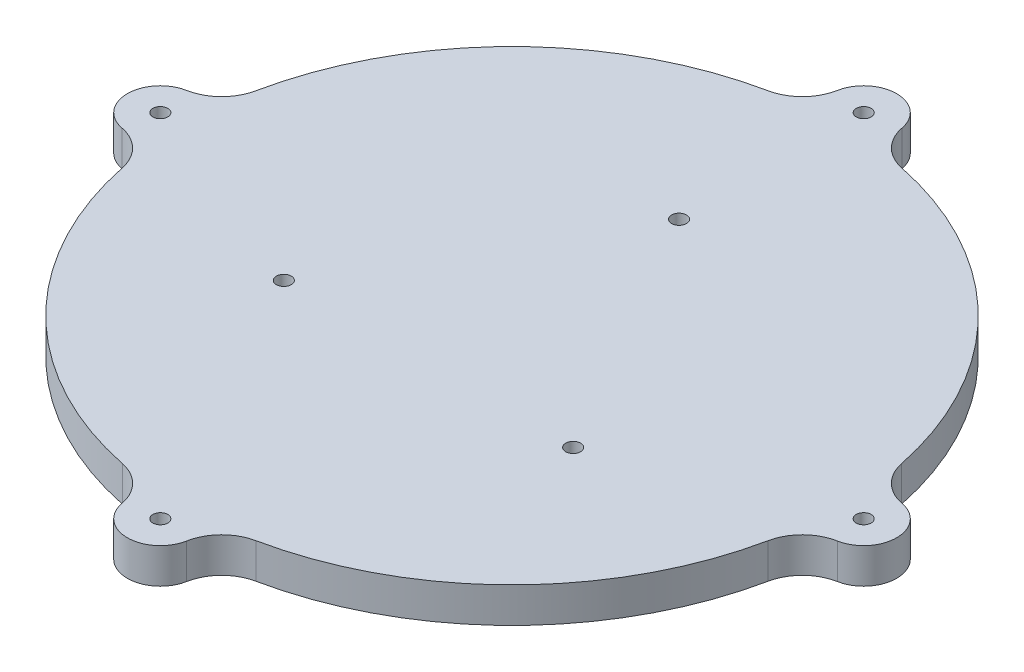
ISO-10303-21;
HEADER;
FILE_DESCRIPTION(('STEP AP214'),'2;1');
FILE_NAME('part.step','',(''),(''),'','','');
FILE_SCHEMA(('AUTOMOTIVE_DESIGN { 1 0 10303 214 1 1 1 1 }'));
ENDSEC;
DATA;
#1=APPLICATION_CONTEXT('core data for automotive mechanical design processes');
#2=APPLICATION_PROTOCOL_DEFINITION('international standard','automotive_design',2000,#1);
#3=PRODUCT_CONTEXT('',#1,'mechanical');
#4=PRODUCT('Part','Part','',(#3));
#5=PRODUCT_RELATED_PRODUCT_CATEGORY('part','',(#4));
#6=PRODUCT_DEFINITION_FORMATION('','',#4);
#7=PRODUCT_DEFINITION_CONTEXT('part definition',#1,'design');
#8=PRODUCT_DEFINITION('design','',#6,#7);
#9=PRODUCT_DEFINITION_SHAPE('','',#8);
#10=(LENGTH_UNIT() NAMED_UNIT(*) SI_UNIT(.MILLI.,.METRE.));
#11=(NAMED_UNIT(*) PLANE_ANGLE_UNIT() SI_UNIT($,.RADIAN.));
#12=(NAMED_UNIT(*) SI_UNIT($,.STERADIAN.) SOLID_ANGLE_UNIT());
#13=UNCERTAINTY_MEASURE_WITH_UNIT(LENGTH_MEASURE(1.E-05),#10,'distance_accuracy_value','');
#14=(GEOMETRIC_REPRESENTATION_CONTEXT(3) GLOBAL_UNCERTAINTY_ASSIGNED_CONTEXT((#13)) GLOBAL_UNIT_ASSIGNED_CONTEXT((#10,
#11,#12)) REPRESENTATION_CONTEXT('',''));
#15=CARTESIAN_POINT('',(0.,0.,0.));
#16=DIRECTION('',(0.,0.,1.));
#17=DIRECTION('',(1.,0.,0.));
#18=AXIS2_PLACEMENT_3D('',#15,#16,#17);
#19=CARTESIAN_POINT('',(0.,8.,0.));
#20=DIRECTION('',(0.,-1.,0.));
#21=DIRECTION('',(0.,0.,-1.));
#22=AXIS2_PLACEMENT_3D('',#19,#20,#21);
#23=CYLINDRICAL_SURFACE('',#22,75.);
#24=CARTESIAN_POINT('',(0.,8.,0.));
#25=DIRECTION('',(0.,1.,0.));
#26=DIRECTION('',(0.,0.,1.));
#27=AXIS2_PLACEMENT_3D('',#24,#25,#26);
#28=CIRCLE('',#27,75.);
#29=CARTESIAN_POINT('',(73.4489889705883,8.,-15.1738597330541));
#30=VERTEX_POINT('',#29);
#31=CARTESIAN_POINT('',(15.1738597330543,8.,-73.4489889705883));
#32=VERTEX_POINT('',#31);
#33=EDGE_CURVE('E247',#30,#32,#28,.T.);
#34=ORIENTED_EDGE('',*,*,#33,.F.);
#35=DIRECTION('',(0.,-1.,0.));
#36=VECTOR('',#35,1.);
#37=CARTESIAN_POINT('',(73.4489889705883,8.,-15.1738597330541));
#38=LINE('',#37,#36);
#39=CARTESIAN_POINT('',(73.4489889705883,0.,-15.1738597330541));
#40=VERTEX_POINT('',#39);
#41=EDGE_CURVE('E266',#30,#40,#38,.T.);
#42=ORIENTED_EDGE('',*,*,#41,.T.);
#43=CARTESIAN_POINT('',(0.,0.,0.));
#44=DIRECTION('',(0.,1.,0.));
#45=DIRECTION('',(0.,0.,1.));
#46=AXIS2_PLACEMENT_3D('',#43,#44,#45);
#47=CIRCLE('',#46,75.);
#48=CARTESIAN_POINT('',(15.1738597330543,0.,-73.4489889705883));
#49=VERTEX_POINT('',#48);
#50=EDGE_CURVE('E195',#40,#49,#47,.T.);
#51=ORIENTED_EDGE('',*,*,#50,.T.);
#52=DIRECTION('',(0.,-1.,0.));
#53=VECTOR('',#52,1.);
#54=CARTESIAN_POINT('',(15.1738597330543,8.,-73.4489889705883));
#55=LINE('',#54,#53);
#56=EDGE_CURVE('E263',#49,#32,#55,.F.);
#57=ORIENTED_EDGE('',*,*,#56,.T.);
#58=EDGE_LOOP('',(#34,#42,#51,#57));
#59=FACE_BOUND('',#58,.T.);
#60=ADVANCED_FACE('F44',(#59),#23,.T.);
#61=CARTESIAN_POINT('',(0.,8.,-80.));
#62=DIRECTION('',(0.,-1.,0.));
#63=DIRECTION('',(0.,0.,-1.));
#64=AXIS2_PLACEMENT_3D('',#61,#62,#63);
#65=CYLINDRICAL_SURFACE('',#64,7.5);
#66=CARTESIAN_POINT('',(0.,8.,-80.));
#67=DIRECTION('',(0.,1.,0.));
#68=DIRECTION('',(0.,0.,1.));
#69=AXIS2_PLACEMENT_3D('',#66,#67,#68);
#70=CIRCLE('',#69,7.5);
#71=CARTESIAN_POINT('',(7.37016044176925,8.,-81.3895089285714));
#72=VERTEX_POINT('',#71);
#73=CARTESIAN_POINT('',(-7.37016044176925,8.,-81.3895089285714));
#74=VERTEX_POINT('',#73);
#75=EDGE_CURVE('E499',#72,#74,#70,.T.);
#76=ORIENTED_EDGE('',*,*,#75,.F.);
#77=DIRECTION('',(0.,-1.,0.));
#78=VECTOR('',#77,1.);
#79=CARTESIAN_POINT('',(7.37016044176925,8.,-81.3895089285714));
#80=LINE('',#79,#78);
#81=CARTESIAN_POINT('',(7.37016044176925,0.,-81.3895089285714));
#82=VERTEX_POINT('',#81);
#83=EDGE_CURVE('E272',#72,#82,#80,.T.);
#84=ORIENTED_EDGE('',*,*,#83,.T.);
#85=CARTESIAN_POINT('',(0.,0.,-80.));
#86=DIRECTION('',(0.,1.,0.));
#87=DIRECTION('',(0.,0.,1.));
#88=AXIS2_PLACEMENT_3D('',#85,#86,#87);
#89=CIRCLE('',#88,7.5);
#90=CARTESIAN_POINT('',(-7.37016044176925,0.,-81.3895089285714));
#91=VERTEX_POINT('',#90);
#92=EDGE_CURVE('E209',#82,#91,#89,.T.);
#93=ORIENTED_EDGE('',*,*,#92,.T.);
#94=DIRECTION('',(0.,-1.,0.));
#95=VECTOR('',#94,1.);
#96=CARTESIAN_POINT('',(-7.37016044176925,8.,-81.3895089285714));
#97=LINE('',#96,#95);
#98=EDGE_CURVE('E269',#91,#74,#97,.F.);
#99=ORIENTED_EDGE('',*,*,#98,.T.);
#100=EDGE_LOOP('',(#76,#84,#93,#99));
#101=FACE_BOUND('',#100,.T.);
#102=ADVANCED_FACE('F359',(#101),#65,.T.);
#103=CARTESIAN_POINT('',(-15.1738597330543,8.,-73.4489889705883));
#104=VERTEX_POINT('',#103);
#105=CARTESIAN_POINT('',(-73.4489889705881,8.,-15.1738597330551));
#106=VERTEX_POINT('',#105);
#107=EDGE_CURVE('E409',#104,#106,#28,.T.);
#108=ORIENTED_EDGE('',*,*,#107,.F.);
#109=DIRECTION('',(0.,-1.,0.));
#110=VECTOR('',#109,1.);
#111=CARTESIAN_POINT('',(-15.1738597330543,8.,-73.4489889705883));
#112=LINE('',#111,#110);
#113=CARTESIAN_POINT('',(-15.1738597330543,0.,-73.4489889705883));
#114=VERTEX_POINT('',#113);
#115=EDGE_CURVE('E279',#104,#114,#112,.T.);
#116=ORIENTED_EDGE('',*,*,#115,.T.);
#117=CARTESIAN_POINT('',(-73.4489889705881,0.,-15.1738597330551));
#118=VERTEX_POINT('',#117);
#119=EDGE_CURVE('E206',#114,#118,#47,.T.);
#120=ORIENTED_EDGE('',*,*,#119,.T.);
#121=DIRECTION('',(0.,-1.,0.));
#122=VECTOR('',#121,1.);
#123=CARTESIAN_POINT('',(-73.4489889705881,8.,-15.1738597330551));
#124=LINE('',#123,#122);
#125=EDGE_CURVE('E276',#118,#106,#124,.F.);
#126=ORIENTED_EDGE('',*,*,#125,.T.);
#127=EDGE_LOOP('',(#108,#116,#120,#126));
#128=FACE_BOUND('',#127,.T.);
#129=ADVANCED_FACE('F361',(#128),#23,.T.);
#130=CARTESIAN_POINT('',(-80.,8.,-8.37955521322352E-13));
#131=DIRECTION('',(0.,-1.,0.));
#132=DIRECTION('',(0.,0.,-1.));
#133=AXIS2_PLACEMENT_3D('',#130,#131,#132);
#134=CYLINDRICAL_SURFACE('',#133,7.5);
#135=CARTESIAN_POINT('',(-80.,8.,-8.37955521322352E-13));
#136=DIRECTION('',(0.,1.,0.));
#137=DIRECTION('',(0.,0.,1.));
#138=AXIS2_PLACEMENT_3D('',#135,#136,#137);
#139=CIRCLE('',#138,7.5);
#140=CARTESIAN_POINT('',(-81.3895089285713,8.,-7.3701604417701));
#141=VERTEX_POINT('',#140);
#142=CARTESIAN_POINT('',(-81.3895089285715,8.,7.3701604417684));
#143=VERTEX_POINT('',#142);
#144=EDGE_CURVE('E408',#141,#143,#139,.T.);
#145=ORIENTED_EDGE('',*,*,#144,.F.);
#146=DIRECTION('',(0.,-1.,0.));
#147=VECTOR('',#146,1.);
#148=CARTESIAN_POINT('',(-81.3895089285713,8.,-7.3701604417701));
#149=LINE('',#148,#147);
#150=CARTESIAN_POINT('',(-81.3895089285713,0.,-7.3701604417701));
#151=VERTEX_POINT('',#150);
#152=EDGE_CURVE('E285',#141,#151,#149,.T.);
#153=ORIENTED_EDGE('',*,*,#152,.T.);
#154=CARTESIAN_POINT('',(-80.,0.,-8.37955521322352E-13));
#155=DIRECTION('',(0.,1.,0.));
#156=DIRECTION('',(0.,0.,1.));
#157=AXIS2_PLACEMENT_3D('',#154,#155,#156);
#158=CIRCLE('',#157,7.5);
#159=CARTESIAN_POINT('',(-81.3895089285715,0.,7.3701604417684));
#160=VERTEX_POINT('',#159);
#161=EDGE_CURVE('E205',#151,#160,#158,.T.);
#162=ORIENTED_EDGE('',*,*,#161,.T.);
#163=DIRECTION('',(0.,-1.,0.));
#164=VECTOR('',#163,1.);
#165=CARTESIAN_POINT('',(-81.3895089285715,8.,7.3701604417684));
#166=LINE('',#165,#164);
#167=EDGE_CURVE('E282',#160,#143,#166,.F.);
#168=ORIENTED_EDGE('',*,*,#167,.T.);
#169=EDGE_LOOP('',(#145,#153,#162,#168));
#170=FACE_BOUND('',#169,.T.);
#171=ADVANCED_FACE('F371',(#170),#134,.T.);
#172=CARTESIAN_POINT('',(-73.4489889705884,0.,15.1738597330536));
#173=VERTEX_POINT('',#172);
#174=CARTESIAN_POINT('',(-15.1738597330548,0.,73.4489889705881));
#175=VERTEX_POINT('',#174);
#176=EDGE_CURVE('E194',#173,#175,#47,.T.);
#177=ORIENTED_EDGE('',*,*,#176,.T.);
#178=DIRECTION('',(0.,-1.,0.));
#179=VECTOR('',#178,1.);
#180=CARTESIAN_POINT('',(-15.1738597330548,8.,73.4489889705881));
#181=LINE('',#180,#179);
#182=CARTESIAN_POINT('',(-15.1738597330548,8.,73.4489889705881));
#183=VERTEX_POINT('',#182);
#184=EDGE_CURVE('E62',#175,#183,#181,.F.);
#185=ORIENTED_EDGE('',*,*,#184,.T.);
#186=CARTESIAN_POINT('',(-73.4489889705884,8.,15.1738597330536));
#187=VERTEX_POINT('',#186);
#188=EDGE_CURVE('E401',#187,#183,#28,.T.);
#189=ORIENTED_EDGE('',*,*,#188,.F.);
#190=DIRECTION('',(0.,-1.,0.));
#191=VECTOR('',#190,1.);
#192=CARTESIAN_POINT('',(-73.4489889705884,8.,15.1738597330536));
#193=LINE('',#192,#191);
#194=EDGE_CURVE('E288',#187,#173,#193,.T.);
#195=ORIENTED_EDGE('',*,*,#194,.T.);
#196=EDGE_LOOP('',(#177,#185,#189,#195));
#197=FACE_BOUND('',#196,.T.);
#198=ADVANCED_FACE('F372',(#197),#23,.T.);
#199=CARTESIAN_POINT('',(-5.58637014214901E-13,8.,80.));
#200=DIRECTION('',(0.,-1.,0.));
#201=DIRECTION('',(0.,0.,-1.));
#202=AXIS2_PLACEMENT_3D('',#199,#200,#201);
#203=CYLINDRICAL_SURFACE('',#202,7.5);
#204=CARTESIAN_POINT('',(-5.58637014214901E-13,0.,80.));
#205=DIRECTION('',(0.,1.,0.));
#206=DIRECTION('',(0.,0.,1.));
#207=AXIS2_PLACEMENT_3D('',#204,#205,#206);
#208=CIRCLE('',#207,7.5);
#209=CARTESIAN_POINT('',(-7.37016044176982,0.,81.3895089285714));
#210=VERTEX_POINT('',#209);
#211=CARTESIAN_POINT('',(7.37016044176868,0.,81.3895089285715));
#212=VERTEX_POINT('',#211);
#213=EDGE_CURVE('E192',#210,#212,#208,.T.);
#214=ORIENTED_EDGE('',*,*,#213,.T.);
#215=DIRECTION('',(0.,-1.,0.));
#216=VECTOR('',#215,1.);
#217=CARTESIAN_POINT('',(7.37016044176868,8.,81.3895089285715));
#218=LINE('',#217,#216);
#219=CARTESIAN_POINT('',(7.37016044176868,8.,81.3895089285715));
#220=VERTEX_POINT('',#219);
#221=EDGE_CURVE('E165',#212,#220,#218,.F.);
#222=ORIENTED_EDGE('',*,*,#221,.T.);
#223=CARTESIAN_POINT('',(-5.58637014214901E-13,8.,80.));
#224=DIRECTION('',(0.,1.,0.));
#225=DIRECTION('',(0.,0.,1.));
#226=AXIS2_PLACEMENT_3D('',#223,#224,#225);
#227=CIRCLE('',#226,7.5);
#228=CARTESIAN_POINT('',(-7.37016044176982,8.,81.3895089285714));
#229=VERTEX_POINT('',#228);
#230=EDGE_CURVE('E400',#229,#220,#227,.T.);
#231=ORIENTED_EDGE('',*,*,#230,.F.);
#232=DIRECTION('',(0.,-1.,0.));
#233=VECTOR('',#232,1.);
#234=CARTESIAN_POINT('',(-7.37016044176982,8.,81.3895089285714));
#235=LINE('',#234,#233);
#236=EDGE_CURVE('E182',#229,#210,#235,.T.);
#237=ORIENTED_EDGE('',*,*,#236,.T.);
#238=EDGE_LOOP('',(#214,#222,#231,#237));
#239=FACE_BOUND('',#238,.T.);
#240=ADVANCED_FACE('F375',(#239),#203,.T.);
#241=CARTESIAN_POINT('',(15.1738597330538,8.,73.4489889705883));
#242=VERTEX_POINT('',#241);
#243=CARTESIAN_POINT('',(73.4489889705882,8.,15.1738597330546));
#244=VERTEX_POINT('',#243);
#245=EDGE_CURVE('E180',#242,#244,#28,.T.);
#246=ORIENTED_EDGE('',*,*,#245,.F.);
#247=DIRECTION('',(0.,-1.,0.));
#248=VECTOR('',#247,1.);
#249=CARTESIAN_POINT('',(15.1738597330538,8.,73.4489889705883));
#250=LINE('',#249,#248);
#251=CARTESIAN_POINT('',(15.1738597330538,0.,73.4489889705883));
#252=VERTEX_POINT('',#251);
#253=EDGE_CURVE('E164',#242,#252,#250,.T.);
#254=ORIENTED_EDGE('',*,*,#253,.T.);
#255=CARTESIAN_POINT('',(73.4489889705882,0.,15.1738597330546));
#256=VERTEX_POINT('',#255);
#257=EDGE_CURVE('E177',#252,#256,#47,.T.);
#258=ORIENTED_EDGE('',*,*,#257,.T.);
#259=DIRECTION('',(0.,-1.,0.));
#260=VECTOR('',#259,1.);
#261=CARTESIAN_POINT('',(73.4489889705882,8.,15.1738597330546));
#262=LINE('',#261,#260);
#263=EDGE_CURVE('E183',#256,#244,#262,.F.);
#264=ORIENTED_EDGE('',*,*,#263,.T.);
#265=EDGE_LOOP('',(#246,#254,#258,#264));
#266=FACE_BOUND('',#265,.T.);
#267=ADVANCED_FACE('F176',(#266),#23,.T.);
#268=CARTESIAN_POINT('',(-5.58637014214901E-13,8.,80.));
#269=DIRECTION('',(0.,-1.,0.));
#270=DIRECTION('',(0.,0.,-1.));
#271=AXIS2_PLACEMENT_3D('',#268,#269,#270);
#272=CYLINDRICAL_SURFACE('',#271,1.7);
#273=CARTESIAN_POINT('',(-5.58637014214901E-13,8.,80.));
#274=DIRECTION('',(0.,1.,0.));
#275=DIRECTION('',(0.,0.,1.));
#276=AXIS2_PLACEMENT_3D('',#273,#274,#275);
#277=CIRCLE('',#276,1.7);
#278=CARTESIAN_POINT('',(-5.58637014214901E-13,8.,81.7));
#279=VERTEX_POINT('',#278);
#280=EDGE_CURVE('E423',#279,#279,#277,.T.);
#281=ORIENTED_EDGE('',*,*,#280,.T.);
#282=EDGE_LOOP('',(#281));
#283=FACE_BOUND('',#282,.T.);
#284=CARTESIAN_POINT('',(-5.58637014214901E-13,0.,80.));
#285=DIRECTION('',(0.,1.,0.));
#286=DIRECTION('',(0.,0.,1.));
#287=AXIS2_PLACEMENT_3D('',#284,#285,#286);
#288=CIRCLE('',#287,1.7);
#289=CARTESIAN_POINT('',(-5.58637014214901E-13,0.,81.7));
#290=VERTEX_POINT('',#289);
#291=EDGE_CURVE('E239',#290,#290,#288,.T.);
#292=ORIENTED_EDGE('',*,*,#291,.F.);
#293=EDGE_LOOP('',(#292));
#294=FACE_BOUND('',#293,.T.);
#295=ADVANCED_FACE('F374',(#283,#294),#272,.F.);
#296=CARTESIAN_POINT('',(80.,8.,2.79318507107451E-13));
#297=DIRECTION('',(0.,-1.,0.));
#298=DIRECTION('',(0.,0.,-1.));
#299=AXIS2_PLACEMENT_3D('',#296,#297,#298);
#300=CYLINDRICAL_SURFACE('',#299,1.7);
#301=CARTESIAN_POINT('',(80.,8.,2.79318507107451E-13));
#302=DIRECTION('',(0.,1.,0.));
#303=DIRECTION('',(0.,0.,1.));
#304=AXIS2_PLACEMENT_3D('',#301,#302,#303);
#305=CIRCLE('',#304,1.7);
#306=CARTESIAN_POINT('',(80.,8.,1.70000000000028));
#307=VERTEX_POINT('',#306);
#308=EDGE_CURVE('E419',#307,#307,#305,.T.);
#309=ORIENTED_EDGE('',*,*,#308,.T.);
#310=EDGE_LOOP('',(#309));
#311=FACE_BOUND('',#310,.T.);
#312=CARTESIAN_POINT('',(80.,0.,2.79318507107451E-13));
#313=DIRECTION('',(0.,1.,0.));
#314=DIRECTION('',(0.,0.,1.));
#315=AXIS2_PLACEMENT_3D('',#312,#313,#314);
#316=CIRCLE('',#315,1.7);
#317=CARTESIAN_POINT('',(80.,0.,1.70000000000028));
#318=VERTEX_POINT('',#317);
#319=EDGE_CURVE('E235',#318,#318,#316,.T.);
#320=ORIENTED_EDGE('',*,*,#319,.F.);
#321=EDGE_LOOP('',(#320));
#322=FACE_BOUND('',#321,.T.);
#323=ADVANCED_FACE('F380',(#311,#322),#300,.F.);
#324=CARTESIAN_POINT('',(0.,8.,-80.));
#325=DIRECTION('',(0.,-1.,0.));
#326=DIRECTION('',(0.,0.,-1.));
#327=AXIS2_PLACEMENT_3D('',#324,#325,#326);
#328=CYLINDRICAL_SURFACE('',#327,1.7);
#329=CARTESIAN_POINT('',(0.,8.,-80.));
#330=DIRECTION('',(0.,1.,0.));
#331=DIRECTION('',(0.,0.,1.));
#332=AXIS2_PLACEMENT_3D('',#329,#330,#331);
#333=CIRCLE('',#332,1.7);
#334=CARTESIAN_POINT('',(0.,8.,-78.3));
#335=VERTEX_POINT('',#334);
#336=EDGE_CURVE('E415',#335,#335,#333,.T.);
#337=ORIENTED_EDGE('',*,*,#336,.T.);
#338=EDGE_LOOP('',(#337));
#339=FACE_BOUND('',#338,.T.);
#340=CARTESIAN_POINT('',(0.,0.,-80.));
#341=DIRECTION('',(0.,1.,0.));
#342=DIRECTION('',(0.,0.,1.));
#343=AXIS2_PLACEMENT_3D('',#340,#341,#342);
#344=CIRCLE('',#343,1.7);
#345=CARTESIAN_POINT('',(0.,0.,-78.3));
#346=VERTEX_POINT('',#345);
#347=EDGE_CURVE('E199',#346,#346,#344,.T.);
#348=ORIENTED_EDGE('',*,*,#347,.F.);
#349=EDGE_LOOP('',(#348));
#350=FACE_BOUND('',#349,.T.);
#351=ADVANCED_FACE('F449',(#339,#350),#328,.F.);
#352=CARTESIAN_POINT('',(80.,8.,2.79318507107451E-13));
#353=DIRECTION('',(0.,-1.,0.));
#354=DIRECTION('',(0.,0.,-1.));
#355=AXIS2_PLACEMENT_3D('',#352,#353,#354);
#356=CYLINDRICAL_SURFACE('',#355,7.5);
#357=CARTESIAN_POINT('',(80.,8.,2.79318507107451E-13));
#358=DIRECTION('',(0.,1.,0.));
#359=DIRECTION('',(0.,0.,1.));
#360=AXIS2_PLACEMENT_3D('',#357,#358,#359);
#361=CIRCLE('',#360,7.5);
#362=CARTESIAN_POINT('',(81.3895089285714,8.,7.37016044176953));
#363=VERTEX_POINT('',#362);
#364=CARTESIAN_POINT('',(81.3895089285715,8.,-7.37016044176897));
#365=VERTEX_POINT('',#364);
#366=EDGE_CURVE('E406',#363,#365,#361,.T.);
#367=ORIENTED_EDGE('',*,*,#366,.F.);
#368=DIRECTION('',(0.,-1.,0.));
#369=VECTOR('',#368,1.);
#370=CARTESIAN_POINT('',(81.3895089285714,8.,7.37016044176953));
#371=LINE('',#370,#369);
#372=CARTESIAN_POINT('',(81.3895089285714,0.,7.37016044176953));
#373=VERTEX_POINT('',#372);
#374=EDGE_CURVE('E259',#363,#373,#371,.T.);
#375=ORIENTED_EDGE('',*,*,#374,.T.);
#376=CARTESIAN_POINT('',(80.,0.,2.79318507107451E-13));
#377=DIRECTION('',(0.,1.,0.));
#378=DIRECTION('',(0.,0.,1.));
#379=AXIS2_PLACEMENT_3D('',#376,#377,#378);
#380=CIRCLE('',#379,7.5);
#381=CARTESIAN_POINT('',(81.3895089285715,0.,-7.37016044176897));
#382=VERTEX_POINT('',#381);
#383=EDGE_CURVE('E191',#373,#382,#380,.T.);
#384=ORIENTED_EDGE('',*,*,#383,.T.);
#385=DIRECTION('',(0.,-1.,0.));
#386=VECTOR('',#385,1.);
#387=CARTESIAN_POINT('',(81.3895089285715,8.,-7.37016044176897));
#388=LINE('',#387,#386);
#389=EDGE_CURVE('E256',#382,#365,#388,.F.);
#390=ORIENTED_EDGE('',*,*,#389,.T.);
#391=EDGE_LOOP('',(#367,#375,#384,#390));
#392=FACE_BOUND('',#391,.T.);
#393=ADVANCED_FACE('F442',(#392),#356,.T.);
#394=CARTESIAN_POINT('',(-80.,8.,-8.37955521322352E-13));
#395=DIRECTION('',(0.,-1.,0.));
#396=DIRECTION('',(0.,0.,-1.));
#397=AXIS2_PLACEMENT_3D('',#394,#395,#396);
#398=CYLINDRICAL_SURFACE('',#397,1.7);
#399=CARTESIAN_POINT('',(-80.,8.,-8.37955521322352E-13));
#400=DIRECTION('',(0.,1.,0.));
#401=DIRECTION('',(0.,0.,1.));
#402=AXIS2_PLACEMENT_3D('',#399,#400,#401);
#403=CIRCLE('',#402,1.7);
#404=CARTESIAN_POINT('',(-80.,8.,1.69999999999917));
#405=VERTEX_POINT('',#404);
#406=EDGE_CURVE('E249',#405,#405,#403,.T.);
#407=ORIENTED_EDGE('',*,*,#406,.T.);
#408=EDGE_LOOP('',(#407));
#409=FACE_BOUND('',#408,.T.);
#410=CARTESIAN_POINT('',(-80.,0.,-8.37955521322352E-13));
#411=DIRECTION('',(0.,1.,0.));
#412=DIRECTION('',(0.,0.,1.));
#413=AXIS2_PLACEMENT_3D('',#410,#411,#412);
#414=CIRCLE('',#413,1.7);
#415=CARTESIAN_POINT('',(-80.,0.,1.69999999999917));
#416=VERTEX_POINT('',#415);
#417=EDGE_CURVE('E243',#416,#416,#414,.T.);
#418=ORIENTED_EDGE('',*,*,#417,.F.);
#419=EDGE_LOOP('',(#418));
#420=FACE_BOUND('',#419,.T.);
#421=ADVANCED_FACE('F430',(#409,#420),#398,.F.);
#422=CARTESIAN_POINT('',(0.,8.,0.));
#423=DIRECTION('',(0.,1.,0.));
#424=DIRECTION('',(0.,0.,1.));
#425=AXIS2_PLACEMENT_3D('',#422,#423,#424);
#426=PLANE('',#425);
#427=CARTESIAN_POINT('',(0.,8.,-38.));
#428=DIRECTION('',(0.,1.,0.));
#429=DIRECTION('',(0.,0.,1.));
#430=AXIS2_PLACEMENT_3D('',#427,#428,#429);
#431=CIRCLE('',#430,1.7);
#432=CARTESIAN_POINT('',(0.,8.,-36.3));
#433=VERTEX_POINT('',#432);
#434=EDGE_CURVE('E336',#433,#433,#431,.T.);
#435=ORIENTED_EDGE('',*,*,#434,.F.);
#436=EDGE_LOOP('',(#435));
#437=FACE_BOUND('',#436,.T.);
#438=CARTESIAN_POINT('',(32.9089653438086,8.,19.0000000000002));
#439=DIRECTION('',(0.,1.,0.));
#440=DIRECTION('',(0.,0.,1.));
#441=AXIS2_PLACEMENT_3D('',#438,#439,#440);
#442=CIRCLE('',#441,1.7);
#443=CARTESIAN_POINT('',(32.9089653438086,8.,20.7000000000002));
#444=VERTEX_POINT('',#443);
#445=EDGE_CURVE('E518',#444,#444,#442,.T.);
#446=ORIENTED_EDGE('',*,*,#445,.F.);
#447=EDGE_LOOP('',(#446));
#448=FACE_BOUND('',#447,.T.);
#449=CARTESIAN_POINT('',(-32.9089653438086,8.,19.0000000000002));
#450=DIRECTION('',(0.,1.,0.));
#451=DIRECTION('',(0.,0.,1.));
#452=AXIS2_PLACEMENT_3D('',#449,#450,#451);
#453=CIRCLE('',#452,1.7);
#454=CARTESIAN_POINT('',(-32.9089653438086,8.,20.7000000000002));
#455=VERTEX_POINT('',#454);
#456=EDGE_CURVE('E514',#455,#455,#453,.T.);
#457=ORIENTED_EDGE('',*,*,#456,.F.);
#458=EDGE_LOOP('',(#457));
#459=FACE_BOUND('',#458,.T.);
#460=ORIENTED_EDGE('',*,*,#366,.T.);
#461=CARTESIAN_POINT('',(83.2421875000001,8.,-17.1970410307946));
#462=DIRECTION('',(0.,1.,0.));
#463=DIRECTION('',(0.,0.,1.));
#464=AXIS2_PLACEMENT_3D('',#461,#462,#463);
#465=CIRCLE('',#464,10.);
#466=EDGE_CURVE('E304',#365,#30,#465,.F.);
#467=ORIENTED_EDGE('',*,*,#466,.T.);
#468=ORIENTED_EDGE('',*,*,#33,.T.);
#469=CARTESIAN_POINT('',(17.1970410307949,8.,-83.2421875));
#470=DIRECTION('',(0.,1.,0.));
#471=DIRECTION('',(0.,0.,1.));
#472=AXIS2_PLACEMENT_3D('',#469,#470,#471);
#473=CIRCLE('',#472,10.);
#474=EDGE_CURVE('E310',#32,#72,#473,.F.);
#475=ORIENTED_EDGE('',*,*,#474,.T.);
#476=ORIENTED_EDGE('',*,*,#75,.T.);
#477=CARTESIAN_POINT('',(-17.1970410307949,8.,-83.2421875));
#478=DIRECTION('',(0.,1.,0.));
#479=DIRECTION('',(0.,0.,1.));
#480=AXIS2_PLACEMENT_3D('',#477,#478,#479);
#481=CIRCLE('',#480,10.);
#482=EDGE_CURVE('E316',#74,#104,#481,.F.);
#483=ORIENTED_EDGE('',*,*,#482,.T.);
#484=ORIENTED_EDGE('',*,*,#107,.T.);
#485=CARTESIAN_POINT('',(-83.2421874999998,8.,-17.1970410307958));
#486=DIRECTION('',(0.,1.,0.));
#487=DIRECTION('',(0.,0.,1.));
#488=AXIS2_PLACEMENT_3D('',#485,#486,#487);
#489=CIRCLE('',#488,10.);
#490=EDGE_CURVE('E322',#106,#141,#489,.F.);
#491=ORIENTED_EDGE('',*,*,#490,.T.);
#492=ORIENTED_EDGE('',*,*,#144,.T.);
#493=CARTESIAN_POINT('',(-83.2421875000002,8.,17.197041030794));
#494=DIRECTION('',(0.,1.,0.));
#495=DIRECTION('',(0.,0.,1.));
#496=AXIS2_PLACEMENT_3D('',#493,#494,#495);
#497=CIRCLE('',#496,10.);
#498=EDGE_CURVE('E11',#143,#187,#497,.F.);
#499=ORIENTED_EDGE('',*,*,#498,.T.);
#500=ORIENTED_EDGE('',*,*,#188,.T.);
#501=CARTESIAN_POINT('',(-17.1970410307955,8.,83.2421874999999));
#502=DIRECTION('',(0.,1.,0.));
#503=DIRECTION('',(0.,0.,1.));
#504=AXIS2_PLACEMENT_3D('',#501,#502,#503);
#505=CIRCLE('',#504,10.);
#506=EDGE_CURVE('E328',#183,#229,#505,.F.);
#507=ORIENTED_EDGE('',*,*,#506,.T.);
#508=ORIENTED_EDGE('',*,*,#230,.T.);
#509=CARTESIAN_POINT('',(17.1970410307943,8.,83.2421875000001));
#510=DIRECTION('',(0.,1.,0.));
#511=DIRECTION('',(0.,0.,1.));
#512=AXIS2_PLACEMENT_3D('',#509,#510,#511);
#513=CIRCLE('',#512,10.);
#514=EDGE_CURVE('E171',#220,#242,#513,.F.);
#515=ORIENTED_EDGE('',*,*,#514,.T.);
#516=ORIENTED_EDGE('',*,*,#245,.T.);
#517=CARTESIAN_POINT('',(83.2421875,8.,17.1970410307952));
#518=DIRECTION('',(0.,1.,0.));
#519=DIRECTION('',(0.,0.,1.));
#520=AXIS2_PLACEMENT_3D('',#517,#518,#519);
#521=CIRCLE('',#520,10.);
#522=EDGE_CURVE('E298',#244,#363,#521,.F.);
#523=ORIENTED_EDGE('',*,*,#522,.T.);
#524=EDGE_LOOP('',(#460,#467,#468,#475,#476,#483,#484,#491,#492,#499,#500,#507,#508,#515,#516,#523));
#525=FACE_BOUND('',#524,.T.);
#526=ORIENTED_EDGE('',*,*,#336,.F.);
#527=EDGE_LOOP('',(#526));
#528=FACE_BOUND('',#527,.T.);
#529=ORIENTED_EDGE('',*,*,#308,.F.);
#530=EDGE_LOOP('',(#529));
#531=FACE_BOUND('',#530,.T.);
#532=ORIENTED_EDGE('',*,*,#280,.F.);
#533=EDGE_LOOP('',(#532));
#534=FACE_BOUND('',#533,.T.);
#535=ORIENTED_EDGE('',*,*,#406,.F.);
#536=EDGE_LOOP('',(#535));
#537=FACE_BOUND('',#536,.T.);
#538=ADVANCED_FACE('F398',(#437,#448,#459,#525,#528,#531,#534,#537),#426,.T.);
#539=CARTESIAN_POINT('',(0.,0.,0.));
#540=DIRECTION('',(0.,1.,0.));
#541=DIRECTION('',(0.,0.,1.));
#542=AXIS2_PLACEMENT_3D('',#539,#540,#541);
#543=PLANE('',#542);
#544=CARTESIAN_POINT('',(0.,0.,-38.));
#545=DIRECTION('',(0.,1.,0.));
#546=DIRECTION('',(0.,0.,1.));
#547=AXIS2_PLACEMENT_3D('',#544,#545,#546);
#548=CIRCLE('',#547,1.7);
#549=CARTESIAN_POINT('',(0.,0.,-36.3));
#550=VERTEX_POINT('',#549);
#551=EDGE_CURVE('E48',#550,#550,#548,.T.);
#552=ORIENTED_EDGE('',*,*,#551,.T.);
#553=EDGE_LOOP('',(#552));
#554=FACE_BOUND('',#553,.T.);
#555=CARTESIAN_POINT('',(32.9089653438086,0.,19.0000000000002));
#556=DIRECTION('',(0.,1.,0.));
#557=DIRECTION('',(0.,0.,1.));
#558=AXIS2_PLACEMENT_3D('',#555,#556,#557);
#559=CIRCLE('',#558,1.7);
#560=CARTESIAN_POINT('',(32.9089653438086,0.,20.7000000000002));
#561=VERTEX_POINT('',#560);
#562=EDGE_CURVE('E217',#561,#561,#559,.T.);
#563=ORIENTED_EDGE('',*,*,#562,.T.);
#564=EDGE_LOOP('',(#563));
#565=FACE_BOUND('',#564,.T.);
#566=CARTESIAN_POINT('',(-32.9089653438086,0.,19.0000000000002));
#567=DIRECTION('',(0.,1.,0.));
#568=DIRECTION('',(0.,0.,1.));
#569=AXIS2_PLACEMENT_3D('',#566,#567,#568);
#570=CIRCLE('',#569,1.7);
#571=CARTESIAN_POINT('',(-32.9089653438086,0.,20.7000000000002));
#572=VERTEX_POINT('',#571);
#573=EDGE_CURVE('E333',#572,#572,#570,.T.);
#574=ORIENTED_EDGE('',*,*,#573,.T.);
#575=EDGE_LOOP('',(#574));
#576=FACE_BOUND('',#575,.T.);
#577=ORIENTED_EDGE('',*,*,#50,.F.);
#578=CARTESIAN_POINT('',(83.2421875000001,0.,-17.1970410307946));
#579=DIRECTION('',(0.,1.,0.));
#580=DIRECTION('',(0.,0.,1.));
#581=AXIS2_PLACEMENT_3D('',#578,#579,#580);
#582=CIRCLE('',#581,10.);
#583=EDGE_CURVE('E301',#40,#382,#582,.T.);
#584=ORIENTED_EDGE('',*,*,#583,.T.);
#585=ORIENTED_EDGE('',*,*,#383,.F.);
#586=CARTESIAN_POINT('',(83.2421875,0.,17.1970410307952));
#587=DIRECTION('',(0.,1.,0.));
#588=DIRECTION('',(0.,0.,1.));
#589=AXIS2_PLACEMENT_3D('',#586,#587,#588);
#590=CIRCLE('',#589,10.);
#591=EDGE_CURVE('E189',#373,#256,#590,.T.);
#592=ORIENTED_EDGE('',*,*,#591,.T.);
#593=ORIENTED_EDGE('',*,*,#257,.F.);
#594=CARTESIAN_POINT('',(17.1970410307943,0.,83.2421875000001));
#595=DIRECTION('',(0.,1.,0.));
#596=DIRECTION('',(0.,0.,1.));
#597=AXIS2_PLACEMENT_3D('',#594,#595,#596);
#598=CIRCLE('',#597,10.);
#599=EDGE_CURVE('E160',#252,#212,#598,.T.);
#600=ORIENTED_EDGE('',*,*,#599,.T.);
#601=ORIENTED_EDGE('',*,*,#213,.F.);
#602=CARTESIAN_POINT('',(-17.1970410307955,0.,83.2421874999999));
#603=DIRECTION('',(0.,1.,0.));
#604=DIRECTION('',(0.,0.,1.));
#605=AXIS2_PLACEMENT_3D('',#602,#603,#604);
#606=CIRCLE('',#605,10.);
#607=EDGE_CURVE('E325',#210,#175,#606,.T.);
#608=ORIENTED_EDGE('',*,*,#607,.T.);
#609=ORIENTED_EDGE('',*,*,#176,.F.);
#610=CARTESIAN_POINT('',(-83.2421875000002,0.,17.197041030794));
#611=DIRECTION('',(0.,1.,0.));
#612=DIRECTION('',(0.,0.,1.));
#613=AXIS2_PLACEMENT_3D('',#610,#611,#612);
#614=CIRCLE('',#613,10.);
#615=EDGE_CURVE('E54',#173,#160,#614,.T.);
#616=ORIENTED_EDGE('',*,*,#615,.T.);
#617=ORIENTED_EDGE('',*,*,#161,.F.);
#618=CARTESIAN_POINT('',(-83.2421874999998,0.,-17.1970410307958));
#619=DIRECTION('',(0.,1.,0.));
#620=DIRECTION('',(0.,0.,1.));
#621=AXIS2_PLACEMENT_3D('',#618,#619,#620);
#622=CIRCLE('',#621,10.);
#623=EDGE_CURVE('E319',#151,#118,#622,.T.);
#624=ORIENTED_EDGE('',*,*,#623,.T.);
#625=ORIENTED_EDGE('',*,*,#119,.F.);
#626=CARTESIAN_POINT('',(-17.1970410307949,0.,-83.2421875));
#627=DIRECTION('',(0.,1.,0.));
#628=DIRECTION('',(0.,0.,1.));
#629=AXIS2_PLACEMENT_3D('',#626,#627,#628);
#630=CIRCLE('',#629,10.);
#631=EDGE_CURVE('E313',#114,#91,#630,.T.);
#632=ORIENTED_EDGE('',*,*,#631,.T.);
#633=ORIENTED_EDGE('',*,*,#92,.F.);
#634=CARTESIAN_POINT('',(17.1970410307949,0.,-83.2421875));
#635=DIRECTION('',(0.,1.,0.));
#636=DIRECTION('',(0.,0.,1.));
#637=AXIS2_PLACEMENT_3D('',#634,#635,#636);
#638=CIRCLE('',#637,10.);
#639=EDGE_CURVE('E307',#82,#49,#638,.T.);
#640=ORIENTED_EDGE('',*,*,#639,.T.);
#641=EDGE_LOOP('',(#577,#584,#585,#592,#593,#600,#601,#608,#609,#616,#617,#624,#625,#632,#633,#640));
#642=FACE_BOUND('',#641,.T.);
#643=ORIENTED_EDGE('',*,*,#347,.T.);
#644=EDGE_LOOP('',(#643));
#645=FACE_BOUND('',#644,.T.);
#646=ORIENTED_EDGE('',*,*,#319,.T.);
#647=EDGE_LOOP('',(#646));
#648=FACE_BOUND('',#647,.T.);
#649=ORIENTED_EDGE('',*,*,#291,.T.);
#650=EDGE_LOOP('',(#649));
#651=FACE_BOUND('',#650,.T.);
#652=ORIENTED_EDGE('',*,*,#417,.T.);
#653=EDGE_LOOP('',(#652));
#654=FACE_BOUND('',#653,.T.);
#655=ADVANCED_FACE('F186',(#554,#565,#576,#642,#645,#648,#651,#654),#543,.F.);
#656=CARTESIAN_POINT('',(17.1970410307943,8.,83.2421875000001));
#657=DIRECTION('',(0.,1.,0.));
#658=DIRECTION('',(0.,0.,1.));
#659=AXIS2_PLACEMENT_3D('',#656,#657,#658);
#660=CYLINDRICAL_SURFACE('',#659,10.);
#661=ORIENTED_EDGE('',*,*,#514,.F.);
#662=ORIENTED_EDGE('',*,*,#221,.F.);
#663=ORIENTED_EDGE('',*,*,#599,.F.);
#664=ORIENTED_EDGE('',*,*,#253,.F.);
#665=EDGE_LOOP('',(#661,#662,#663,#664));
#666=FACE_BOUND('',#665,.T.);
#667=ADVANCED_FACE('F163',(#666),#660,.F.);
#668=CARTESIAN_POINT('',(83.2421875,8.,17.1970410307952));
#669=DIRECTION('',(0.,1.,0.));
#670=DIRECTION('',(0.,0.,1.));
#671=AXIS2_PLACEMENT_3D('',#668,#669,#670);
#672=CYLINDRICAL_SURFACE('',#671,10.);
#673=ORIENTED_EDGE('',*,*,#522,.F.);
#674=ORIENTED_EDGE('',*,*,#263,.F.);
#675=ORIENTED_EDGE('',*,*,#591,.F.);
#676=ORIENTED_EDGE('',*,*,#374,.F.);
#677=EDGE_LOOP('',(#673,#674,#675,#676));
#678=FACE_BOUND('',#677,.T.);
#679=ADVANCED_FACE('F463',(#678),#672,.F.);
#680=CARTESIAN_POINT('',(83.2421875000001,8.,-17.1970410307946));
#681=DIRECTION('',(0.,1.,0.));
#682=DIRECTION('',(0.,0.,1.));
#683=AXIS2_PLACEMENT_3D('',#680,#681,#682);
#684=CYLINDRICAL_SURFACE('',#683,10.);
#685=ORIENTED_EDGE('',*,*,#466,.F.);
#686=ORIENTED_EDGE('',*,*,#389,.F.);
#687=ORIENTED_EDGE('',*,*,#583,.F.);
#688=ORIENTED_EDGE('',*,*,#41,.F.);
#689=EDGE_LOOP('',(#685,#686,#687,#688));
#690=FACE_BOUND('',#689,.T.);
#691=ADVANCED_FACE('F465',(#690),#684,.F.);
#692=CARTESIAN_POINT('',(17.1970410307949,8.,-83.2421875));
#693=DIRECTION('',(0.,1.,0.));
#694=DIRECTION('',(0.,0.,1.));
#695=AXIS2_PLACEMENT_3D('',#692,#693,#694);
#696=CYLINDRICAL_SURFACE('',#695,10.);
#697=ORIENTED_EDGE('',*,*,#474,.F.);
#698=ORIENTED_EDGE('',*,*,#56,.F.);
#699=ORIENTED_EDGE('',*,*,#639,.F.);
#700=ORIENTED_EDGE('',*,*,#83,.F.);
#701=EDGE_LOOP('',(#697,#698,#699,#700));
#702=FACE_BOUND('',#701,.T.);
#703=ADVANCED_FACE('F471',(#702),#696,.F.);
#704=CARTESIAN_POINT('',(-17.1970410307949,8.,-83.2421875));
#705=DIRECTION('',(0.,1.,0.));
#706=DIRECTION('',(0.,0.,1.));
#707=AXIS2_PLACEMENT_3D('',#704,#705,#706);
#708=CYLINDRICAL_SURFACE('',#707,10.);
#709=ORIENTED_EDGE('',*,*,#482,.F.);
#710=ORIENTED_EDGE('',*,*,#98,.F.);
#711=ORIENTED_EDGE('',*,*,#631,.F.);
#712=ORIENTED_EDGE('',*,*,#115,.F.);
#713=EDGE_LOOP('',(#709,#710,#711,#712));
#714=FACE_BOUND('',#713,.T.);
#715=ADVANCED_FACE('F478',(#714),#708,.F.);
#716=CARTESIAN_POINT('',(-83.2421874999998,8.,-17.1970410307958));
#717=DIRECTION('',(0.,1.,0.));
#718=DIRECTION('',(0.,0.,1.));
#719=AXIS2_PLACEMENT_3D('',#716,#717,#718);
#720=CYLINDRICAL_SURFACE('',#719,10.);
#721=ORIENTED_EDGE('',*,*,#490,.F.);
#722=ORIENTED_EDGE('',*,*,#125,.F.);
#723=ORIENTED_EDGE('',*,*,#623,.F.);
#724=ORIENTED_EDGE('',*,*,#152,.F.);
#725=EDGE_LOOP('',(#721,#722,#723,#724));
#726=FACE_BOUND('',#725,.T.);
#727=ADVANCED_FACE('F482',(#726),#720,.F.);
#728=CARTESIAN_POINT('',(-17.1970410307955,8.,83.2421874999999));
#729=DIRECTION('',(0.,1.,0.));
#730=DIRECTION('',(0.,0.,1.));
#731=AXIS2_PLACEMENT_3D('',#728,#729,#730);
#732=CYLINDRICAL_SURFACE('',#731,10.);
#733=ORIENTED_EDGE('',*,*,#506,.F.);
#734=ORIENTED_EDGE('',*,*,#184,.F.);
#735=ORIENTED_EDGE('',*,*,#607,.F.);
#736=ORIENTED_EDGE('',*,*,#236,.F.);
#737=EDGE_LOOP('',(#733,#734,#735,#736));
#738=FACE_BOUND('',#737,.T.);
#739=ADVANCED_FACE('F393',(#738),#732,.F.);
#740=CARTESIAN_POINT('',(-83.2421875000002,8.,17.197041030794));
#741=DIRECTION('',(0.,1.,0.));
#742=DIRECTION('',(0.,0.,1.));
#743=AXIS2_PLACEMENT_3D('',#740,#741,#742);
#744=CYLINDRICAL_SURFACE('',#743,10.);
#745=ORIENTED_EDGE('',*,*,#498,.F.);
#746=ORIENTED_EDGE('',*,*,#167,.F.);
#747=ORIENTED_EDGE('',*,*,#615,.F.);
#748=ORIENTED_EDGE('',*,*,#194,.F.);
#749=EDGE_LOOP('',(#745,#746,#747,#748));
#750=FACE_BOUND('',#749,.T.);
#751=ADVANCED_FACE('F46',(#750),#744,.F.);
#752=CARTESIAN_POINT('',(-32.9089653438086,-31.,19.0000000000002));
#753=DIRECTION('',(0.,1.,0.));
#754=DIRECTION('',(0.,0.,1.));
#755=AXIS2_PLACEMENT_3D('',#752,#753,#754);
#756=CYLINDRICAL_SURFACE('',#755,1.7);
#757=ORIENTED_EDGE('',*,*,#456,.T.);
#758=EDGE_LOOP('',(#757));
#759=FACE_BOUND('',#758,.T.);
#760=ORIENTED_EDGE('',*,*,#573,.F.);
#761=EDGE_LOOP('',(#760));
#762=FACE_BOUND('',#761,.T.);
#763=ADVANCED_FACE('F346',(#759,#762),#756,.F.);
#764=CARTESIAN_POINT('',(32.9089653438086,-31.,19.0000000000002));
#765=DIRECTION('',(0.,1.,0.));
#766=DIRECTION('',(0.,0.,1.));
#767=AXIS2_PLACEMENT_3D('',#764,#765,#766);
#768=CYLINDRICAL_SURFACE('',#767,1.7);
#769=ORIENTED_EDGE('',*,*,#445,.T.);
#770=EDGE_LOOP('',(#769));
#771=FACE_BOUND('',#770,.T.);
#772=ORIENTED_EDGE('',*,*,#562,.F.);
#773=EDGE_LOOP('',(#772));
#774=FACE_BOUND('',#773,.T.);
#775=ADVANCED_FACE('F343',(#771,#774),#768,.F.);
#776=CARTESIAN_POINT('',(0.,-31.,-38.));
#777=DIRECTION('',(0.,1.,0.));
#778=DIRECTION('',(0.,0.,1.));
#779=AXIS2_PLACEMENT_3D('',#776,#777,#778);
#780=CYLINDRICAL_SURFACE('',#779,1.7);
#781=ORIENTED_EDGE('',*,*,#434,.T.);
#782=EDGE_LOOP('',(#781));
#783=FACE_BOUND('',#782,.T.);
#784=ORIENTED_EDGE('',*,*,#551,.F.);
#785=EDGE_LOOP('',(#784));
#786=FACE_BOUND('',#785,.T.);
#787=ADVANCED_FACE('F345',(#783,#786),#780,.F.);
#788=CLOSED_SHELL('',(#60,#102,#129,#171,#198,#240,#267,#295,#323,#351,#393,#421,#538,#655,#667,
#679,#691,#703,#715,#727,#739,#751,#763,#775,#787));
#789=MANIFOLD_SOLID_BREP('B2',#788);
#790=ADVANCED_BREP_SHAPE_REPRESENTATION('',(#18,#789),#14);
#791=SHAPE_DEFINITION_REPRESENTATION(#9,#790);
ENDSEC;
END-ISO-10303-21;
